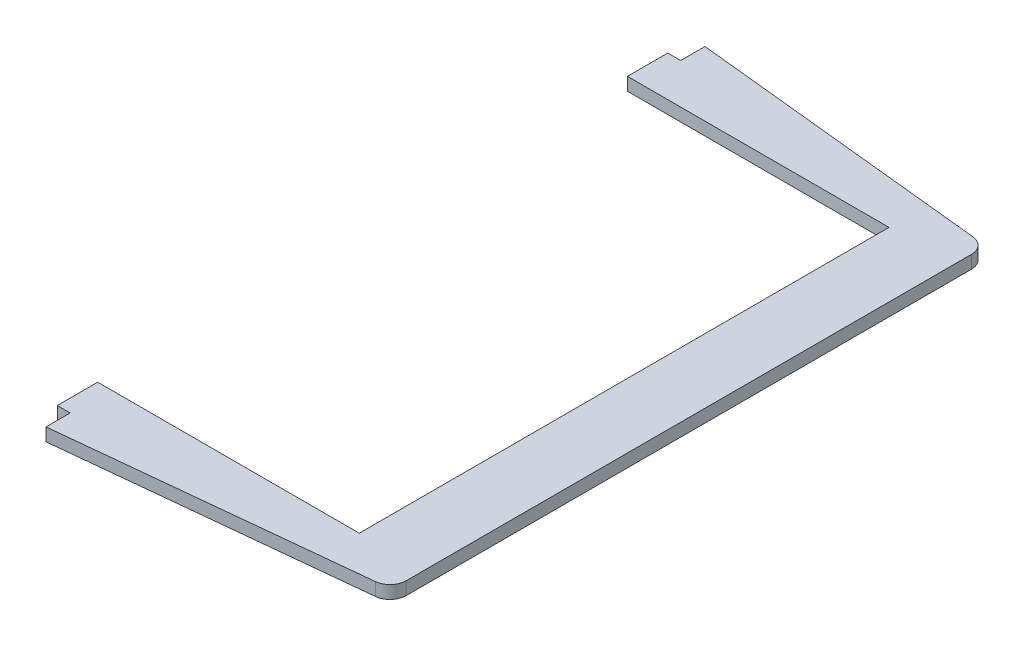
ISO-10303-21;
HEADER;
FILE_DESCRIPTION(('STEP AP214'),'2;1');
FILE_NAME('part.step','',(''),(''),'','','');
FILE_SCHEMA(('AUTOMOTIVE_DESIGN { 1 0 10303 214 1 1 1 1 }'));
ENDSEC;
DATA;
#1=APPLICATION_CONTEXT('core data for automotive mechanical design processes');
#2=APPLICATION_PROTOCOL_DEFINITION('international standard','automotive_design',2000,#1);
#3=PRODUCT_CONTEXT('',#1,'mechanical');
#4=PRODUCT('Part','Part','',(#3));
#5=PRODUCT_RELATED_PRODUCT_CATEGORY('part','',(#4));
#6=PRODUCT_DEFINITION_FORMATION('','',#4);
#7=PRODUCT_DEFINITION_CONTEXT('part definition',#1,'design');
#8=PRODUCT_DEFINITION('design','',#6,#7);
#9=PRODUCT_DEFINITION_SHAPE('','',#8);
#10=(LENGTH_UNIT() NAMED_UNIT(*) SI_UNIT(.MILLI.,.METRE.));
#11=(NAMED_UNIT(*) PLANE_ANGLE_UNIT() SI_UNIT($,.RADIAN.));
#12=(NAMED_UNIT(*) SI_UNIT($,.STERADIAN.) SOLID_ANGLE_UNIT());
#13=UNCERTAINTY_MEASURE_WITH_UNIT(LENGTH_MEASURE(1.E-05),#10,'distance_accuracy_value','');
#14=(GEOMETRIC_REPRESENTATION_CONTEXT(3) GLOBAL_UNCERTAINTY_ASSIGNED_CONTEXT((#13)) GLOBAL_UNIT_ASSIGNED_CONTEXT((#10,
#11,#12)) REPRESENTATION_CONTEXT('',''));
#15=CARTESIAN_POINT('',(0.,0.,0.));
#16=DIRECTION('',(0.,0.,1.));
#17=DIRECTION('',(1.,0.,0.));
#18=AXIS2_PLACEMENT_3D('',#15,#16,#17);
#19=CARTESIAN_POINT('',(128.25199610707,0.,-208.28));
#20=DIRECTION('',(0.,1.,0.));
#21=DIRECTION('',(1.,0.,0.));
#22=AXIS2_PLACEMENT_3D('',#19,#20,#21);
#23=PLANE('',#22);
#24=DIRECTION('',(0.,0.,1.));
#25=VECTOR('',#24,1.);
#26=CARTESIAN_POINT('',(0.,0.,0.));
#27=LINE('',#26,#25);
#28=CARTESIAN_POINT('',(0.,0.,0.));
#29=VERTEX_POINT('',#28);
#30=CARTESIAN_POINT('',(0.,0.,31.75));
#31=VERTEX_POINT('',#30);
#32=EDGE_CURVE('E27',#29,#31,#27,.T.);
#33=ORIENTED_EDGE('',*,*,#32,.F.);
#34=DIRECTION('',(-1.,0.,0.));
#35=VECTOR('',#34,1.);
#36=CARTESIAN_POINT('',(205.703992214139,0.,0.));
#37=LINE('',#36,#35);
#38=CARTESIAN_POINT('',(205.703992214139,0.,0.));
#39=VERTEX_POINT('',#38);
#40=EDGE_CURVE('E174',#39,#29,#37,.T.);
#41=ORIENTED_EDGE('',*,*,#40,.F.);
#42=DIRECTION('',(0.,0.,1.));
#43=VECTOR('',#42,1.);
#44=CARTESIAN_POINT('',(205.703992214139,0.,-416.56));
#45=LINE('',#44,#43);
#46=CARTESIAN_POINT('',(205.703992214139,0.,-416.56));
#47=VERTEX_POINT('',#46);
#48=EDGE_CURVE('E156',#47,#39,#45,.T.);
#49=ORIENTED_EDGE('',*,*,#48,.F.);
#50=DIRECTION('',(1.,0.,0.));
#51=VECTOR('',#50,1.);
#52=CARTESIAN_POINT('',(-1.77635683940025E-13,0.,-416.56));
#53=LINE('',#52,#51);
#54=CARTESIAN_POINT('',(-1.92623694772464E-13,0.,-416.56));
#55=VERTEX_POINT('',#54);
#56=EDGE_CURVE('E264',#55,#47,#53,.T.);
#57=ORIENTED_EDGE('',*,*,#56,.F.);
#58=DIRECTION('',(0.,0.,1.));
#59=VECTOR('',#58,1.);
#60=CARTESIAN_POINT('',(-2.22044604925032E-13,0.,-448.31));
#61=LINE('',#60,#59);
#62=CARTESIAN_POINT('',(-2.22044604925032E-13,0.,-448.31));
#63=VERTEX_POINT('',#62);
#64=EDGE_CURVE('E211',#63,#55,#61,.T.);
#65=ORIENTED_EDGE('',*,*,#64,.F.);
#66=DIRECTION('',(-1.,0.,0.));
#67=VECTOR('',#66,1.);
#68=CARTESIAN_POINT('',(10.1599999999998,0.,-448.31));
#69=LINE('',#68,#67);
#70=CARTESIAN_POINT('',(10.1599999999998,0.,-448.31));
#71=VERTEX_POINT('',#70);
#72=EDGE_CURVE('E249',#71,#63,#69,.T.);
#73=ORIENTED_EDGE('',*,*,#72,.F.);
#74=DIRECTION('',(0.,0.,1.));
#75=VECTOR('',#74,1.);
#76=CARTESIAN_POINT('',(10.1599999999998,0.,-467.36));
#77=LINE('',#76,#75);
#78=CARTESIAN_POINT('',(10.1599999999998,0.,-467.36));
#79=VERTEX_POINT('',#78);
#80=EDGE_CURVE('E250',#79,#71,#77,.T.);
#81=ORIENTED_EDGE('',*,*,#80,.F.);
#82=DIRECTION('',(-0.994726396988247,0.,-0.102564102564102));
#83=VECTOR('',#82,1.);
#84=CARTESIAN_POINT('',(245.106556316703,0.,-443.135165138769));
#85=LINE('',#84,#83);
#86=CARTESIAN_POINT('',(245.106556316703,0.,-443.135165138769));
#87=VERTEX_POINT('',#86);
#88=EDGE_CURVE('E215',#87,#79,#85,.T.);
#89=ORIENTED_EDGE('',*,*,#88,.F.);
#90=CARTESIAN_POINT('',(243.803992214139,0.,-430.502139897016));
#91=DIRECTION('',(0.,1.,0.));
#92=DIRECTION('',(1.,0.,0.));
#93=AXIS2_PLACEMENT_3D('',#90,#91,#92);
#94=CIRCLE('',#93,12.7000000000001);
#95=CARTESIAN_POINT('',(256.503992214139,0.,-430.502139897016));
#96=VERTEX_POINT('',#95);
#97=EDGE_CURVE('E20',#96,#87,#94,.T.);
#98=ORIENTED_EDGE('',*,*,#97,.F.);
#99=DIRECTION('',(0.,0.,-1.));
#100=VECTOR('',#99,1.);
#101=CARTESIAN_POINT('',(256.503992214139,0.,13.9421398970168));
#102=LINE('',#101,#100);
#103=CARTESIAN_POINT('',(256.503992214139,0.,13.9421398970168));
#104=VERTEX_POINT('',#103);
#105=EDGE_CURVE('E267',#104,#96,#102,.T.);
#106=ORIENTED_EDGE('',*,*,#105,.F.);
#107=CARTESIAN_POINT('',(243.803992214139,0.,13.9421398970168));
#108=DIRECTION('',(0.,1.,0.));
#109=DIRECTION('',(0.102564102564101,0.,0.994726396988248));
#110=AXIS2_PLACEMENT_3D('',#107,#108,#109);
#111=CIRCLE('',#110,12.7);
#112=CARTESIAN_POINT('',(245.106556316703,0.,26.5751651387674));
#113=VERTEX_POINT('',#112);
#114=EDGE_CURVE('E103',#113,#104,#111,.T.);
#115=ORIENTED_EDGE('',*,*,#114,.F.);
#116=DIRECTION('',(0.994726396988247,0.,-0.102564102564103));
#117=VECTOR('',#116,1.);
#118=CARTESIAN_POINT('',(10.16,0.,50.8));
#119=LINE('',#118,#117);
#120=CARTESIAN_POINT('',(10.16,0.,50.8));
#121=VERTEX_POINT('',#120);
#122=EDGE_CURVE('E199',#121,#113,#119,.T.);
#123=ORIENTED_EDGE('',*,*,#122,.F.);
#124=DIRECTION('',(0.,0.,1.));
#125=VECTOR('',#124,1.);
#126=CARTESIAN_POINT('',(10.16,0.,31.75));
#127=LINE('',#126,#125);
#128=CARTESIAN_POINT('',(10.16,0.,31.75));
#129=VERTEX_POINT('',#128);
#130=EDGE_CURVE('E273',#129,#121,#127,.T.);
#131=ORIENTED_EDGE('',*,*,#130,.F.);
#132=DIRECTION('',(1.,0.,0.));
#133=VECTOR('',#132,1.);
#134=CARTESIAN_POINT('',(0.,0.,31.75));
#135=LINE('',#134,#133);
#136=EDGE_CURVE('E191',#31,#129,#135,.T.);
#137=ORIENTED_EDGE('',*,*,#136,.F.);
#138=EDGE_LOOP('',(#33,#41,#49,#57,#65,#73,#81,#89,#98,#106,#115,#123,#131,#137));
#139=FACE_BOUND('',#138,.T.);
#140=ADVANCED_FACE('F16',(#139),#23,.F.);
#141=CARTESIAN_POINT('',(128.25199610707,10.16,-208.28));
#142=DIRECTION('',(0.,1.,0.));
#143=DIRECTION('',(1.,0.,0.));
#144=AXIS2_PLACEMENT_3D('',#141,#142,#143);
#145=PLANE('',#144);
#146=DIRECTION('',(0.,0.,1.));
#147=VECTOR('',#146,1.);
#148=CARTESIAN_POINT('',(0.,10.16,0.));
#149=LINE('',#148,#147);
#150=CARTESIAN_POINT('',(0.,10.16,0.));
#151=VERTEX_POINT('',#150);
#152=CARTESIAN_POINT('',(0.,10.16,31.75));
#153=VERTEX_POINT('',#152);
#154=EDGE_CURVE('E10',#151,#153,#149,.T.);
#155=ORIENTED_EDGE('',*,*,#154,.T.);
#156=DIRECTION('',(1.,0.,0.));
#157=VECTOR('',#156,1.);
#158=CARTESIAN_POINT('',(0.,10.16,31.75));
#159=LINE('',#158,#157);
#160=CARTESIAN_POINT('',(10.16,10.16,31.75));
#161=VERTEX_POINT('',#160);
#162=EDGE_CURVE('E194',#153,#161,#159,.T.);
#163=ORIENTED_EDGE('',*,*,#162,.T.);
#164=DIRECTION('',(0.,0.,1.));
#165=VECTOR('',#164,1.);
#166=CARTESIAN_POINT('',(10.16,10.16,31.75));
#167=LINE('',#166,#165);
#168=CARTESIAN_POINT('',(10.16,10.16,50.8));
#169=VERTEX_POINT('',#168);
#170=EDGE_CURVE('E270',#161,#169,#167,.T.);
#171=ORIENTED_EDGE('',*,*,#170,.T.);
#172=DIRECTION('',(0.994726396988247,0.,-0.102564102564103));
#173=VECTOR('',#172,1.);
#174=CARTESIAN_POINT('',(10.16,10.16,50.8));
#175=LINE('',#174,#173);
#176=CARTESIAN_POINT('',(245.106556316703,10.16,26.5751651387674));
#177=VERTEX_POINT('',#176);
#178=EDGE_CURVE('E202',#169,#177,#175,.T.);
#179=ORIENTED_EDGE('',*,*,#178,.T.);
#180=CARTESIAN_POINT('',(243.803992214139,10.16,13.9421398970168));
#181=DIRECTION('',(0.,1.,0.));
#182=DIRECTION('',(0.102564102564101,0.,0.994726396988248));
#183=AXIS2_PLACEMENT_3D('',#180,#181,#182);
#184=CIRCLE('',#183,12.7);
#185=CARTESIAN_POINT('',(256.503992214139,10.16,13.9421398970168));
#186=VERTEX_POINT('',#185);
#187=EDGE_CURVE('E257',#177,#186,#184,.T.);
#188=ORIENTED_EDGE('',*,*,#187,.T.);
#189=DIRECTION('',(0.,0.,-1.));
#190=VECTOR('',#189,1.);
#191=CARTESIAN_POINT('',(256.503992214139,10.16,13.9421398970168));
#192=LINE('',#191,#190);
#193=CARTESIAN_POINT('',(256.503992214139,10.16,-430.502139897016));
#194=VERTEX_POINT('',#193);
#195=EDGE_CURVE('E114',#186,#194,#192,.T.);
#196=ORIENTED_EDGE('',*,*,#195,.T.);
#197=CARTESIAN_POINT('',(243.803992214139,10.16,-430.502139897016));
#198=DIRECTION('',(0.,1.,0.));
#199=DIRECTION('',(1.,0.,0.));
#200=AXIS2_PLACEMENT_3D('',#197,#198,#199);
#201=CIRCLE('',#200,12.7000000000001);
#202=CARTESIAN_POINT('',(245.106556316703,10.16,-443.135165138769));
#203=VERTEX_POINT('',#202);
#204=EDGE_CURVE('E204',#194,#203,#201,.T.);
#205=ORIENTED_EDGE('',*,*,#204,.T.);
#206=DIRECTION('',(-0.994726396988247,0.,-0.102564102564102));
#207=VECTOR('',#206,1.);
#208=CARTESIAN_POINT('',(245.106556316703,10.16,-443.135165138769));
#209=LINE('',#208,#207);
#210=CARTESIAN_POINT('',(10.1599999999998,10.16,-467.36));
#211=VERTEX_POINT('',#210);
#212=EDGE_CURVE('E212',#203,#211,#209,.T.);
#213=ORIENTED_EDGE('',*,*,#212,.T.);
#214=DIRECTION('',(0.,0.,1.));
#215=VECTOR('',#214,1.);
#216=CARTESIAN_POINT('',(10.1599999999998,10.16,-467.36));
#217=LINE('',#216,#215);
#218=CARTESIAN_POINT('',(10.1599999999998,10.16,-448.31));
#219=VERTEX_POINT('',#218);
#220=EDGE_CURVE('E233',#211,#219,#217,.T.);
#221=ORIENTED_EDGE('',*,*,#220,.T.);
#222=DIRECTION('',(-1.,0.,0.));
#223=VECTOR('',#222,1.);
#224=CARTESIAN_POINT('',(10.1599999999998,10.16,-448.31));
#225=LINE('',#224,#223);
#226=CARTESIAN_POINT('',(-2.22044604925032E-13,10.16,-448.31));
#227=VERTEX_POINT('',#226);
#228=EDGE_CURVE('E258',#219,#227,#225,.T.);
#229=ORIENTED_EDGE('',*,*,#228,.T.);
#230=DIRECTION('',(0.,0.,1.));
#231=VECTOR('',#230,1.);
#232=CARTESIAN_POINT('',(-2.22044604925032E-13,10.16,-448.31));
#233=LINE('',#232,#231);
#234=CARTESIAN_POINT('',(-1.92623694772464E-13,10.16,-416.56));
#235=VERTEX_POINT('',#234);
#236=EDGE_CURVE('E208',#227,#235,#233,.T.);
#237=ORIENTED_EDGE('',*,*,#236,.T.);
#238=DIRECTION('',(1.,0.,0.));
#239=VECTOR('',#238,1.);
#240=CARTESIAN_POINT('',(-1.77635683940025E-13,10.16,-416.56));
#241=LINE('',#240,#239);
#242=CARTESIAN_POINT('',(205.703992214139,10.16,-416.56));
#243=VERTEX_POINT('',#242);
#244=EDGE_CURVE('E243',#235,#243,#241,.T.);
#245=ORIENTED_EDGE('',*,*,#244,.T.);
#246=DIRECTION('',(0.,0.,1.));
#247=VECTOR('',#246,1.);
#248=CARTESIAN_POINT('',(205.703992214139,10.16,-416.56));
#249=LINE('',#248,#247);
#250=CARTESIAN_POINT('',(205.703992214139,10.16,0.));
#251=VERTEX_POINT('',#250);
#252=EDGE_CURVE('E168',#243,#251,#249,.T.);
#253=ORIENTED_EDGE('',*,*,#252,.T.);
#254=DIRECTION('',(-1.,0.,0.));
#255=VECTOR('',#254,1.);
#256=CARTESIAN_POINT('',(205.703992214139,10.16,0.));
#257=LINE('',#256,#255);
#258=EDGE_CURVE('E175',#251,#151,#257,.T.);
#259=ORIENTED_EDGE('',*,*,#258,.T.);
#260=EDGE_LOOP('',(#155,#163,#171,#179,#188,#196,#205,#213,#221,#229,#237,#245,#253,#259));
#261=FACE_BOUND('',#260,.T.);
#262=ADVANCED_FACE('F316',(#261),#145,.T.);
#263=CARTESIAN_POINT('',(0.,0.,0.));
#264=DIRECTION('',(-1.,0.,0.));
#265=DIRECTION('',(0.,0.,1.));
#266=AXIS2_PLACEMENT_3D('',#263,#264,#265);
#267=PLANE('',#266);
#268=ORIENTED_EDGE('',*,*,#32,.T.);
#269=DIRECTION('',(0.,1.,0.));
#270=VECTOR('',#269,1.);
#271=CARTESIAN_POINT('',(0.,0.,31.75));
#272=LINE('',#271,#270);
#273=EDGE_CURVE('E197',#31,#153,#272,.T.);
#274=ORIENTED_EDGE('',*,*,#273,.T.);
#275=ORIENTED_EDGE('',*,*,#154,.F.);
#276=DIRECTION('',(0.,1.,0.));
#277=VECTOR('',#276,1.);
#278=CARTESIAN_POINT('',(0.,0.,0.));
#279=LINE('',#278,#277);
#280=EDGE_CURVE('E181',#29,#151,#279,.T.);
#281=ORIENTED_EDGE('',*,*,#280,.F.);
#282=EDGE_LOOP('',(#268,#274,#275,#281));
#283=FACE_BOUND('',#282,.T.);
#284=ADVANCED_FACE('F446',(#283),#267,.T.);
#285=CARTESIAN_POINT('',(0.,0.,31.75));
#286=DIRECTION('',(0.,0.,1.));
#287=DIRECTION('',(1.,0.,0.));
#288=AXIS2_PLACEMENT_3D('',#285,#286,#287);
#289=PLANE('',#288);
#290=ORIENTED_EDGE('',*,*,#136,.T.);
#291=DIRECTION('',(0.,1.,0.));
#292=VECTOR('',#291,1.);
#293=CARTESIAN_POINT('',(10.16,0.,31.75));
#294=LINE('',#293,#292);
#295=EDGE_CURVE('E195',#129,#161,#294,.T.);
#296=ORIENTED_EDGE('',*,*,#295,.T.);
#297=ORIENTED_EDGE('',*,*,#162,.F.);
#298=ORIENTED_EDGE('',*,*,#273,.F.);
#299=EDGE_LOOP('',(#290,#296,#297,#298));
#300=FACE_BOUND('',#299,.T.);
#301=ADVANCED_FACE('F321',(#300),#289,.T.);
#302=CARTESIAN_POINT('',(10.16,0.,31.75));
#303=DIRECTION('',(-1.,0.,0.));
#304=DIRECTION('',(0.,0.,1.));
#305=AXIS2_PLACEMENT_3D('',#302,#303,#304);
#306=PLANE('',#305);
#307=ORIENTED_EDGE('',*,*,#130,.T.);
#308=DIRECTION('',(0.,1.,0.));
#309=VECTOR('',#308,1.);
#310=CARTESIAN_POINT('',(10.16,0.,50.8));
#311=LINE('',#310,#309);
#312=EDGE_CURVE('E278',#121,#169,#311,.T.);
#313=ORIENTED_EDGE('',*,*,#312,.T.);
#314=ORIENTED_EDGE('',*,*,#170,.F.);
#315=ORIENTED_EDGE('',*,*,#295,.F.);
#316=EDGE_LOOP('',(#307,#313,#314,#315));
#317=FACE_BOUND('',#316,.T.);
#318=ADVANCED_FACE('F310',(#317),#306,.T.);
#319=CARTESIAN_POINT('',(10.16,0.,50.8));
#320=DIRECTION('',(0.102564102564103,0.,0.994726396988247));
#321=DIRECTION('',(0.,-1.,0.));
#322=AXIS2_PLACEMENT_3D('',#319,#320,#321);
#323=PLANE('',#322);
#324=ORIENTED_EDGE('',*,*,#122,.T.);
#325=DIRECTION('',(0.,1.,0.));
#326=VECTOR('',#325,1.);
#327=CARTESIAN_POINT('',(245.106556316703,0.,26.5751651387674));
#328=LINE('',#327,#326);
#329=EDGE_CURVE('E203',#113,#177,#328,.T.);
#330=ORIENTED_EDGE('',*,*,#329,.T.);
#331=ORIENTED_EDGE('',*,*,#178,.F.);
#332=ORIENTED_EDGE('',*,*,#312,.F.);
#333=EDGE_LOOP('',(#324,#330,#331,#332));
#334=FACE_BOUND('',#333,.T.);
#335=ADVANCED_FACE('F18',(#334),#323,.T.);
#336=CARTESIAN_POINT('',(243.803992214139,0.,13.9421398970168));
#337=DIRECTION('',(0.,1.,0.));
#338=DIRECTION('',(0.102564102564101,0.,0.994726396988248));
#339=AXIS2_PLACEMENT_3D('',#336,#337,#338);
#340=CYLINDRICAL_SURFACE('',#339,12.7);
#341=ORIENTED_EDGE('',*,*,#114,.T.);
#342=DIRECTION('',(0.,1.,0.));
#343=VECTOR('',#342,1.);
#344=CARTESIAN_POINT('',(256.503992214139,0.,13.9421398970168));
#345=LINE('',#344,#343);
#346=EDGE_CURVE('E237',#104,#186,#345,.T.);
#347=ORIENTED_EDGE('',*,*,#346,.T.);
#348=ORIENTED_EDGE('',*,*,#187,.F.);
#349=ORIENTED_EDGE('',*,*,#329,.F.);
#350=EDGE_LOOP('',(#341,#347,#348,#349));
#351=FACE_BOUND('',#350,.T.);
#352=ADVANCED_FACE('F468',(#351),#340,.T.);
#353=CARTESIAN_POINT('',(256.503992214139,0.,13.9421398970168));
#354=DIRECTION('',(1.,0.,0.));
#355=DIRECTION('',(0.,0.,-1.));
#356=AXIS2_PLACEMENT_3D('',#353,#354,#355);
#357=PLANE('',#356);
#358=ORIENTED_EDGE('',*,*,#105,.T.);
#359=DIRECTION('',(0.,1.,0.));
#360=VECTOR('',#359,1.);
#361=CARTESIAN_POINT('',(256.503992214139,0.,-430.502139897016));
#362=LINE('',#361,#360);
#363=EDGE_CURVE('E207',#96,#194,#362,.T.);
#364=ORIENTED_EDGE('',*,*,#363,.T.);
#365=ORIENTED_EDGE('',*,*,#195,.F.);
#366=ORIENTED_EDGE('',*,*,#346,.F.);
#367=EDGE_LOOP('',(#358,#364,#365,#366));
#368=FACE_BOUND('',#367,.T.);
#369=ADVANCED_FACE('F473',(#368),#357,.T.);
#370=CARTESIAN_POINT('',(243.803992214139,0.,-430.502139897016));
#371=DIRECTION('',(0.,1.,0.));
#372=DIRECTION('',(1.,0.,0.));
#373=AXIS2_PLACEMENT_3D('',#370,#371,#372);
#374=CYLINDRICAL_SURFACE('',#373,12.7000000000001);
#375=ORIENTED_EDGE('',*,*,#97,.T.);
#376=DIRECTION('',(0.,1.,0.));
#377=VECTOR('',#376,1.);
#378=CARTESIAN_POINT('',(245.106556316703,0.,-443.135165138769));
#379=LINE('',#378,#377);
#380=EDGE_CURVE('E214',#87,#203,#379,.T.);
#381=ORIENTED_EDGE('',*,*,#380,.T.);
#382=ORIENTED_EDGE('',*,*,#204,.F.);
#383=ORIENTED_EDGE('',*,*,#363,.F.);
#384=EDGE_LOOP('',(#375,#381,#382,#383));
#385=FACE_BOUND('',#384,.T.);
#386=ADVANCED_FACE('F461',(#385),#374,.T.);
#387=CARTESIAN_POINT('',(245.106556316703,0.,-443.135165138769));
#388=DIRECTION('',(0.102564102564102,0.,-0.994726396988247));
#389=DIRECTION('',(0.,-1.,0.));
#390=AXIS2_PLACEMENT_3D('',#387,#388,#389);
#391=PLANE('',#390);
#392=ORIENTED_EDGE('',*,*,#88,.T.);
#393=DIRECTION('',(0.,1.,0.));
#394=VECTOR('',#393,1.);
#395=CARTESIAN_POINT('',(10.1599999999998,0.,-467.36));
#396=LINE('',#395,#394);
#397=EDGE_CURVE('E224',#79,#211,#396,.T.);
#398=ORIENTED_EDGE('',*,*,#397,.T.);
#399=ORIENTED_EDGE('',*,*,#212,.F.);
#400=ORIENTED_EDGE('',*,*,#380,.F.);
#401=EDGE_LOOP('',(#392,#398,#399,#400));
#402=FACE_BOUND('',#401,.T.);
#403=ADVANCED_FACE('F426',(#402),#391,.T.);
#404=CARTESIAN_POINT('',(10.1599999999998,0.,-467.36));
#405=DIRECTION('',(-1.,0.,0.));
#406=DIRECTION('',(0.,1.,0.));
#407=AXIS2_PLACEMENT_3D('',#404,#405,#406);
#408=PLANE('',#407);
#409=ORIENTED_EDGE('',*,*,#80,.T.);
#410=DIRECTION('',(0.,1.,0.));
#411=VECTOR('',#410,1.);
#412=CARTESIAN_POINT('',(10.1599999999998,0.,-448.31));
#413=LINE('',#412,#411);
#414=EDGE_CURVE('E253',#71,#219,#413,.T.);
#415=ORIENTED_EDGE('',*,*,#414,.T.);
#416=ORIENTED_EDGE('',*,*,#220,.F.);
#417=ORIENTED_EDGE('',*,*,#397,.F.);
#418=EDGE_LOOP('',(#409,#415,#416,#417));
#419=FACE_BOUND('',#418,.T.);
#420=ADVANCED_FACE('F419',(#419),#408,.T.);
#421=CARTESIAN_POINT('',(10.1599999999998,0.,-448.31));
#422=DIRECTION('',(0.,0.,-1.));
#423=DIRECTION('',(-1.,0.,0.));
#424=AXIS2_PLACEMENT_3D('',#421,#422,#423);
#425=PLANE('',#424);
#426=ORIENTED_EDGE('',*,*,#72,.T.);
#427=DIRECTION('',(0.,1.,0.));
#428=VECTOR('',#427,1.);
#429=CARTESIAN_POINT('',(-2.22044604925032E-13,0.,-448.31));
#430=LINE('',#429,#428);
#431=EDGE_CURVE('E210',#63,#227,#430,.T.);
#432=ORIENTED_EDGE('',*,*,#431,.T.);
#433=ORIENTED_EDGE('',*,*,#228,.F.);
#434=ORIENTED_EDGE('',*,*,#414,.F.);
#435=EDGE_LOOP('',(#426,#432,#433,#434));
#436=FACE_BOUND('',#435,.T.);
#437=ADVANCED_FACE('F425',(#436),#425,.T.);
#438=CARTESIAN_POINT('',(-2.22044604925032E-13,0.,-448.31));
#439=DIRECTION('',(-1.,0.,0.));
#440=DIRECTION('',(0.,1.,0.));
#441=AXIS2_PLACEMENT_3D('',#438,#439,#440);
#442=PLANE('',#441);
#443=ORIENTED_EDGE('',*,*,#64,.T.);
#444=DIRECTION('',(0.,1.,0.));
#445=VECTOR('',#444,1.);
#446=CARTESIAN_POINT('',(-1.92623694772464E-13,0.,-416.56));
#447=LINE('',#446,#445);
#448=EDGE_CURVE('E239',#55,#235,#447,.T.);
#449=ORIENTED_EDGE('',*,*,#448,.T.);
#450=ORIENTED_EDGE('',*,*,#236,.F.);
#451=ORIENTED_EDGE('',*,*,#431,.F.);
#452=EDGE_LOOP('',(#443,#449,#450,#451));
#453=FACE_BOUND('',#452,.T.);
#454=ADVANCED_FACE('F502',(#453),#442,.T.);
#455=CARTESIAN_POINT('',(-1.92623694772464E-13,0.,-416.56));
#456=DIRECTION('',(0.,0.,1.));
#457=DIRECTION('',(1.,0.,0.));
#458=AXIS2_PLACEMENT_3D('',#455,#456,#457);
#459=PLANE('',#458);
#460=ORIENTED_EDGE('',*,*,#56,.T.);
#461=DIRECTION('',(0.,1.,0.));
#462=VECTOR('',#461,1.);
#463=CARTESIAN_POINT('',(205.703992214139,0.,-416.56));
#464=LINE('',#463,#462);
#465=EDGE_CURVE('E163',#47,#243,#464,.T.);
#466=ORIENTED_EDGE('',*,*,#465,.T.);
#467=ORIENTED_EDGE('',*,*,#244,.F.);
#468=ORIENTED_EDGE('',*,*,#448,.F.);
#469=EDGE_LOOP('',(#460,#466,#467,#468));
#470=FACE_BOUND('',#469,.T.);
#471=ADVANCED_FACE('F485',(#470),#459,.T.);
#472=CARTESIAN_POINT('',(205.703992214139,0.,-416.56));
#473=DIRECTION('',(-1.,0.,0.));
#474=DIRECTION('',(0.,1.,0.));
#475=AXIS2_PLACEMENT_3D('',#472,#473,#474);
#476=PLANE('',#475);
#477=ORIENTED_EDGE('',*,*,#48,.T.);
#478=DIRECTION('',(0.,1.,0.));
#479=VECTOR('',#478,1.);
#480=CARTESIAN_POINT('',(205.703992214139,0.,0.));
#481=LINE('',#480,#479);
#482=EDGE_CURVE('E160',#39,#251,#481,.T.);
#483=ORIENTED_EDGE('',*,*,#482,.T.);
#484=ORIENTED_EDGE('',*,*,#252,.F.);
#485=ORIENTED_EDGE('',*,*,#465,.F.);
#486=EDGE_LOOP('',(#477,#483,#484,#485));
#487=FACE_BOUND('',#486,.T.);
#488=ADVANCED_FACE('F158',(#487),#476,.T.);
#489=CARTESIAN_POINT('',(205.703992214139,0.,0.));
#490=DIRECTION('',(0.,0.,-1.));
#491=DIRECTION('',(-1.,0.,0.));
#492=AXIS2_PLACEMENT_3D('',#489,#490,#491);
#493=PLANE('',#492);
#494=ORIENTED_EDGE('',*,*,#40,.T.);
#495=ORIENTED_EDGE('',*,*,#280,.T.);
#496=ORIENTED_EDGE('',*,*,#258,.F.);
#497=ORIENTED_EDGE('',*,*,#482,.F.);
#498=EDGE_LOOP('',(#494,#495,#496,#497));
#499=FACE_BOUND('',#498,.T.);
#500=ADVANCED_FACE('F172',(#499),#493,.T.);
#501=CLOSED_SHELL('',(#140,#262,#284,#301,#318,#335,#352,#369,#386,#403,#420,#437,#454,#471,
#488,#500));
#502=MANIFOLD_SOLID_BREP('B1',#501);
#503=ADVANCED_BREP_SHAPE_REPRESENTATION('',(#18,#502),#14);
#504=SHAPE_DEFINITION_REPRESENTATION(#9,#503);
ENDSEC;
END-ISO-10303-21;
